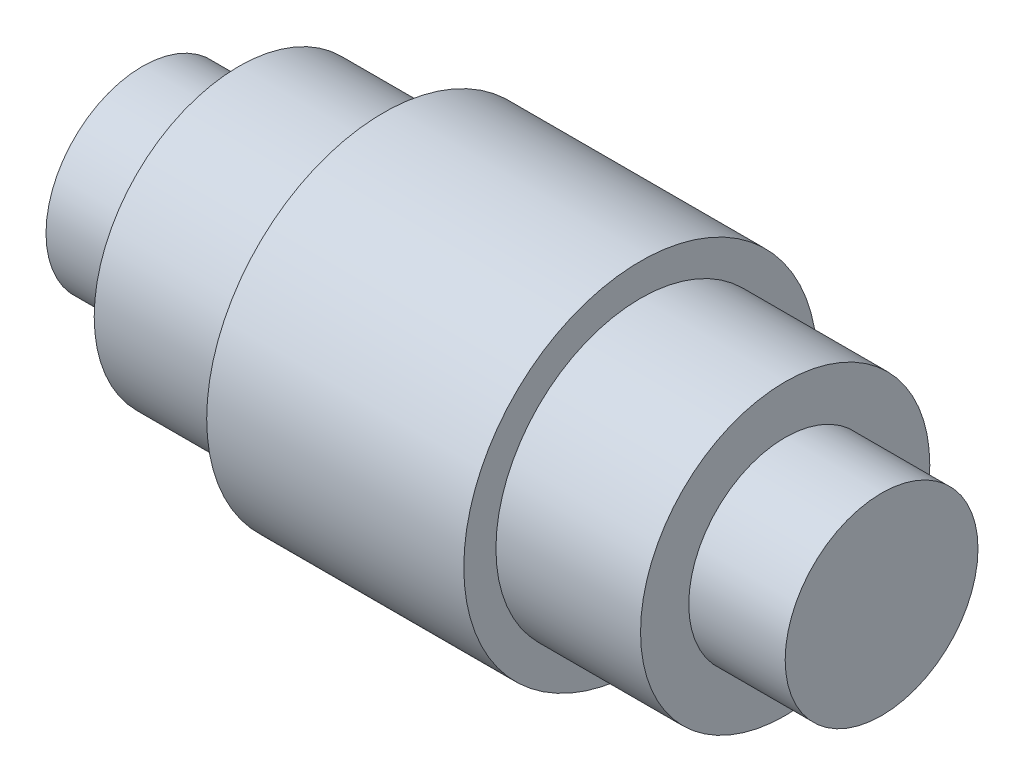
ISO-10303-21;
HEADER;
FILE_DESCRIPTION(('STEP AP214'),'2;1');
FILE_NAME('part.step','',(''),(''),'','','');
FILE_SCHEMA(('AUTOMOTIVE_DESIGN { 1 0 10303 214 1 1 1 1 }'));
ENDSEC;
DATA;
#1=APPLICATION_CONTEXT('core data for automotive mechanical design processes');
#2=APPLICATION_PROTOCOL_DEFINITION('international standard','automotive_design',2000,#1);
#3=PRODUCT_CONTEXT('',#1,'mechanical');
#4=PRODUCT('Part','Part','',(#3));
#5=PRODUCT_RELATED_PRODUCT_CATEGORY('part','',(#4));
#6=PRODUCT_DEFINITION_FORMATION('','',#4);
#7=PRODUCT_DEFINITION_CONTEXT('part definition',#1,'design');
#8=PRODUCT_DEFINITION('design','',#6,#7);
#9=PRODUCT_DEFINITION_SHAPE('','',#8);
#10=(LENGTH_UNIT() NAMED_UNIT(*) SI_UNIT(.MILLI.,.METRE.));
#11=(NAMED_UNIT(*) PLANE_ANGLE_UNIT() SI_UNIT($,.RADIAN.));
#12=(NAMED_UNIT(*) SI_UNIT($,.STERADIAN.) SOLID_ANGLE_UNIT());
#13=UNCERTAINTY_MEASURE_WITH_UNIT(LENGTH_MEASURE(1.E-05),#10,'distance_accuracy_value','');
#14=(GEOMETRIC_REPRESENTATION_CONTEXT(3) GLOBAL_UNCERTAINTY_ASSIGNED_CONTEXT((#13)) GLOBAL_UNIT_ASSIGNED_CONTEXT((#10,
#11,#12)) REPRESENTATION_CONTEXT('',''));
#15=CARTESIAN_POINT('',(0.,0.,0.));
#16=DIRECTION('',(0.,0.,1.));
#17=DIRECTION('',(1.,0.,0.));
#18=AXIS2_PLACEMENT_3D('',#15,#16,#17);
#19=CARTESIAN_POINT('',(0.,0.,0.));
#20=DIRECTION('',(1.,0.,0.));
#21=DIRECTION('',(0.,0.,-1.));
#22=AXIS2_PLACEMENT_3D('',#19,#20,#21);
#23=PLANE('',#22);
#24=CARTESIAN_POINT('',(0.,0.,0.));
#25=DIRECTION('',(-1.,0.,0.));
#26=DIRECTION('',(0.,0.,1.));
#27=AXIS2_PLACEMENT_3D('',#24,#25,#26);
#28=CIRCLE('',#27,30.);
#29=CARTESIAN_POINT('',(0.,0.,30.));
#30=VERTEX_POINT('',#29);
#31=EDGE_CURVE('E10',#30,#30,#28,.T.);
#32=ORIENTED_EDGE('',*,*,#31,.T.);
#33=EDGE_LOOP('',(#32));
#34=FACE_BOUND('',#33,.T.);
#35=ADVANCED_FACE('F43',(#34),#23,.F.);
#36=CARTESIAN_POINT('',(0.,0.,0.));
#37=DIRECTION('',(-1.,0.,0.));
#38=DIRECTION('',(0.,0.,1.));
#39=AXIS2_PLACEMENT_3D('',#36,#37,#38);
#40=CYLINDRICAL_SURFACE('',#39,30.);
#41=ORIENTED_EDGE('',*,*,#31,.F.);
#42=EDGE_LOOP('',(#41));
#43=FACE_BOUND('',#42,.T.);
#44=CARTESIAN_POINT('',(30.,0.,0.));
#45=DIRECTION('',(-1.,0.,0.));
#46=DIRECTION('',(0.,0.,1.));
#47=AXIS2_PLACEMENT_3D('',#44,#45,#46);
#48=CIRCLE('',#47,30.);
#49=CARTESIAN_POINT('',(30.,0.,30.));
#50=VERTEX_POINT('',#49);
#51=EDGE_CURVE('E50',#50,#50,#48,.T.);
#52=ORIENTED_EDGE('',*,*,#51,.T.);
#53=EDGE_LOOP('',(#52));
#54=FACE_BOUND('',#53,.T.);
#55=ADVANCED_FACE('F103',(#43,#54),#40,.T.);
#56=CARTESIAN_POINT('',(30.,30.,0.));
#57=DIRECTION('',(1.,0.,0.));
#58=DIRECTION('',(0.,0.,-1.));
#59=AXIS2_PLACEMENT_3D('',#56,#57,#58);
#60=PLANE('',#59);
#61=ORIENTED_EDGE('',*,*,#51,.F.);
#62=EDGE_LOOP('',(#61));
#63=FACE_BOUND('',#62,.T.);
#64=CARTESIAN_POINT('',(30.,0.,0.));
#65=DIRECTION('',(-1.,0.,0.));
#66=DIRECTION('',(0.,0.,1.));
#67=AXIS2_PLACEMENT_3D('',#64,#65,#66);
#68=CIRCLE('',#67,45.);
#69=CARTESIAN_POINT('',(30.,0.,45.));
#70=VERTEX_POINT('',#69);
#71=EDGE_CURVE('E55',#70,#70,#68,.T.);
#72=ORIENTED_EDGE('',*,*,#71,.T.);
#73=EDGE_LOOP('',(#72));
#74=FACE_BOUND('',#73,.T.);
#75=ADVANCED_FACE('F107',(#63,#74),#60,.F.);
#76=CARTESIAN_POINT('',(0.,0.,0.));
#77=DIRECTION('',(-1.,0.,0.));
#78=DIRECTION('',(0.,0.,1.));
#79=AXIS2_PLACEMENT_3D('',#76,#77,#78);
#80=CYLINDRICAL_SURFACE('',#79,45.);
#81=ORIENTED_EDGE('',*,*,#71,.F.);
#82=EDGE_LOOP('',(#81));
#83=FACE_BOUND('',#82,.T.);
#84=CARTESIAN_POINT('',(75.,0.,0.));
#85=DIRECTION('',(-1.,0.,0.));
#86=DIRECTION('',(0.,0.,1.));
#87=AXIS2_PLACEMENT_3D('',#84,#85,#86);
#88=CIRCLE('',#87,45.);
#89=CARTESIAN_POINT('',(75.,0.,45.));
#90=VERTEX_POINT('',#89);
#91=EDGE_CURVE('E60',#90,#90,#88,.T.);
#92=ORIENTED_EDGE('',*,*,#91,.T.);
#93=EDGE_LOOP('',(#92));
#94=FACE_BOUND('',#93,.T.);
#95=ADVANCED_FACE('F112',(#83,#94),#80,.T.);
#96=CARTESIAN_POINT('',(75.,45.,0.));
#97=DIRECTION('',(1.,0.,0.));
#98=DIRECTION('',(0.,0.,-1.));
#99=AXIS2_PLACEMENT_3D('',#96,#97,#98);
#100=PLANE('',#99);
#101=ORIENTED_EDGE('',*,*,#91,.F.);
#102=EDGE_LOOP('',(#101));
#103=FACE_BOUND('',#102,.T.);
#104=CARTESIAN_POINT('',(75.,0.,0.));
#105=DIRECTION('',(-1.,0.,0.));
#106=DIRECTION('',(0.,0.,1.));
#107=AXIS2_PLACEMENT_3D('',#104,#105,#106);
#108=CIRCLE('',#107,55.);
#109=CARTESIAN_POINT('',(75.,0.,55.));
#110=VERTEX_POINT('',#109);
#111=EDGE_CURVE('E66',#110,#110,#108,.T.);
#112=ORIENTED_EDGE('',*,*,#111,.T.);
#113=EDGE_LOOP('',(#112));
#114=FACE_BOUND('',#113,.T.);
#115=ADVANCED_FACE('F118',(#103,#114),#100,.F.);
#116=CARTESIAN_POINT('',(0.,0.,0.));
#117=DIRECTION('',(-1.,0.,0.));
#118=DIRECTION('',(0.,0.,1.));
#119=AXIS2_PLACEMENT_3D('',#116,#117,#118);
#120=CYLINDRICAL_SURFACE('',#119,55.);
#121=ORIENTED_EDGE('',*,*,#111,.F.);
#122=EDGE_LOOP('',(#121));
#123=FACE_BOUND('',#122,.T.);
#124=CARTESIAN_POINT('',(155.,0.,0.));
#125=DIRECTION('',(-1.,0.,0.));
#126=DIRECTION('',(0.,0.,1.));
#127=AXIS2_PLACEMENT_3D('',#124,#125,#126);
#128=CIRCLE('',#127,55.);
#129=CARTESIAN_POINT('',(155.,0.,55.));
#130=VERTEX_POINT('',#129);
#131=EDGE_CURVE('E70',#130,#130,#128,.T.);
#132=ORIENTED_EDGE('',*,*,#131,.T.);
#133=EDGE_LOOP('',(#132));
#134=FACE_BOUND('',#133,.T.);
#135=ADVANCED_FACE('F122',(#123,#134),#120,.T.);
#136=CARTESIAN_POINT('',(155.,45.,0.));
#137=DIRECTION('',(-1.,0.,0.));
#138=DIRECTION('',(0.,0.,1.));
#139=AXIS2_PLACEMENT_3D('',#136,#137,#138);
#140=PLANE('',#139);
#141=ORIENTED_EDGE('',*,*,#131,.F.);
#142=EDGE_LOOP('',(#141));
#143=FACE_BOUND('',#142,.T.);
#144=CARTESIAN_POINT('',(155.,0.,0.));
#145=DIRECTION('',(-1.,0.,0.));
#146=DIRECTION('',(0.,0.,1.));
#147=AXIS2_PLACEMENT_3D('',#144,#145,#146);
#148=CIRCLE('',#147,45.);
#149=CARTESIAN_POINT('',(155.,0.,45.));
#150=VERTEX_POINT('',#149);
#151=EDGE_CURVE('E74',#150,#150,#148,.T.);
#152=ORIENTED_EDGE('',*,*,#151,.T.);
#153=EDGE_LOOP('',(#152));
#154=FACE_BOUND('',#153,.T.);
#155=ADVANCED_FACE('F126',(#143,#154),#140,.F.);
#156=CARTESIAN_POINT('',(0.,0.,0.));
#157=DIRECTION('',(-1.,0.,0.));
#158=DIRECTION('',(0.,0.,1.));
#159=AXIS2_PLACEMENT_3D('',#156,#157,#158);
#160=CYLINDRICAL_SURFACE('',#159,45.);
#161=ORIENTED_EDGE('',*,*,#151,.F.);
#162=EDGE_LOOP('',(#161));
#163=FACE_BOUND('',#162,.T.);
#164=CARTESIAN_POINT('',(200.,0.,0.));
#165=DIRECTION('',(-1.,0.,0.));
#166=DIRECTION('',(0.,0.,1.));
#167=AXIS2_PLACEMENT_3D('',#164,#165,#166);
#168=CIRCLE('',#167,45.);
#169=CARTESIAN_POINT('',(200.,0.,45.));
#170=VERTEX_POINT('',#169);
#171=EDGE_CURVE('E78',#170,#170,#168,.T.);
#172=ORIENTED_EDGE('',*,*,#171,.T.);
#173=EDGE_LOOP('',(#172));
#174=FACE_BOUND('',#173,.T.);
#175=ADVANCED_FACE('F130',(#163,#174),#160,.T.);
#176=CARTESIAN_POINT('',(200.,30.,0.));
#177=DIRECTION('',(-1.,0.,0.));
#178=DIRECTION('',(0.,0.,1.));
#179=AXIS2_PLACEMENT_3D('',#176,#177,#178);
#180=PLANE('',#179);
#181=ORIENTED_EDGE('',*,*,#171,.F.);
#182=EDGE_LOOP('',(#181));
#183=FACE_BOUND('',#182,.T.);
#184=CARTESIAN_POINT('',(200.,0.,0.));
#185=DIRECTION('',(-1.,0.,0.));
#186=DIRECTION('',(0.,0.,1.));
#187=AXIS2_PLACEMENT_3D('',#184,#185,#186);
#188=CIRCLE('',#187,30.);
#189=CARTESIAN_POINT('',(200.,0.,30.));
#190=VERTEX_POINT('',#189);
#191=EDGE_CURVE('E82',#190,#190,#188,.T.);
#192=ORIENTED_EDGE('',*,*,#191,.T.);
#193=EDGE_LOOP('',(#192));
#194=FACE_BOUND('',#193,.T.);
#195=ADVANCED_FACE('F99',(#183,#194),#180,.F.);
#196=CARTESIAN_POINT('',(0.,0.,0.));
#197=DIRECTION('',(-1.,0.,0.));
#198=DIRECTION('',(0.,0.,1.));
#199=AXIS2_PLACEMENT_3D('',#196,#197,#198);
#200=CYLINDRICAL_SURFACE('',#199,30.);
#201=ORIENTED_EDGE('',*,*,#191,.F.);
#202=EDGE_LOOP('',(#201));
#203=FACE_BOUND('',#202,.T.);
#204=CARTESIAN_POINT('',(230.,0.,0.));
#205=DIRECTION('',(-1.,0.,0.));
#206=DIRECTION('',(0.,0.,1.));
#207=AXIS2_PLACEMENT_3D('',#204,#205,#206);
#208=CIRCLE('',#207,30.);
#209=CARTESIAN_POINT('',(230.,0.,30.));
#210=VERTEX_POINT('',#209);
#211=EDGE_CURVE('E86',#210,#210,#208,.T.);
#212=ORIENTED_EDGE('',*,*,#211,.T.);
#213=EDGE_LOOP('',(#212));
#214=FACE_BOUND('',#213,.T.);
#215=ADVANCED_FACE('F91',(#203,#214),#200,.T.);
#216=CARTESIAN_POINT('',(230.,0.,0.));
#217=DIRECTION('',(-1.,0.,0.));
#218=DIRECTION('',(0.,0.,1.));
#219=AXIS2_PLACEMENT_3D('',#216,#217,#218);
#220=PLANE('',#219);
#221=ORIENTED_EDGE('',*,*,#211,.F.);
#222=EDGE_LOOP('',(#221));
#223=FACE_BOUND('',#222,.T.);
#224=ADVANCED_FACE('F93',(#223),#220,.F.);
#225=CLOSED_SHELL('',(#35,#55,#75,#95,#115,#135,#155,#175,#195,#215,#224));
#226=MANIFOLD_SOLID_BREP('B2',#225);
#227=ADVANCED_BREP_SHAPE_REPRESENTATION('',(#18,#226),#14);
#228=SHAPE_DEFINITION_REPRESENTATION(#9,#227);
ENDSEC;
END-ISO-10303-21;
